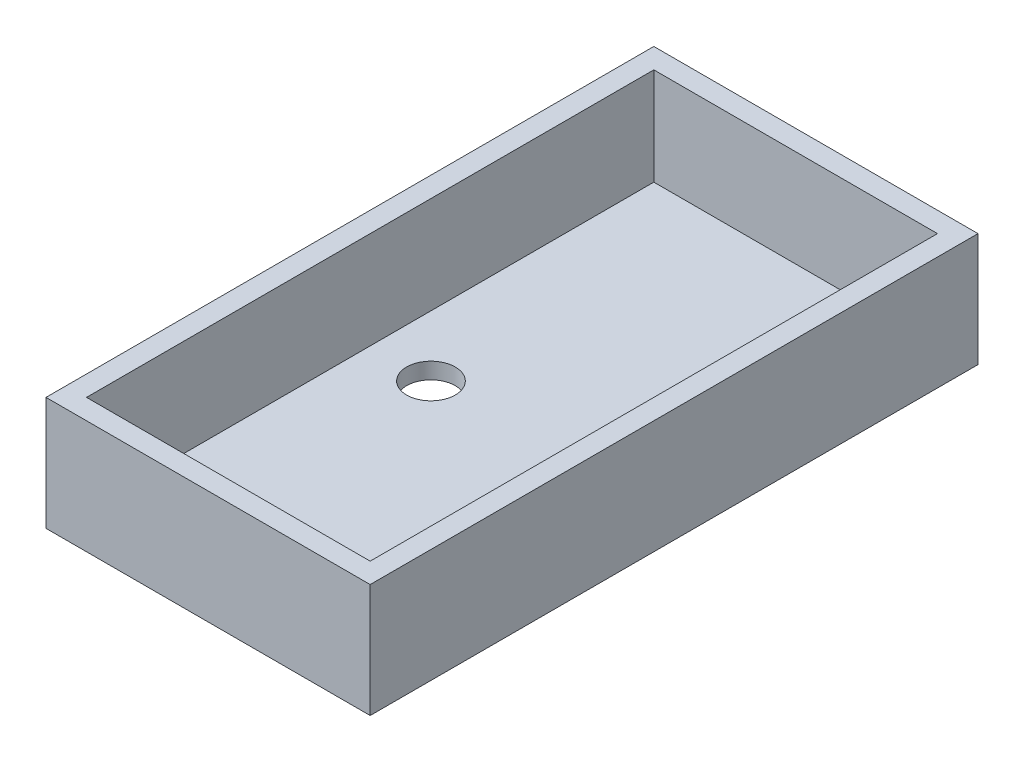
ISO-10303-21;
HEADER;
FILE_DESCRIPTION(('STEP AP214'),'2;1');
FILE_NAME('part.step','',(''),(''),'','','');
FILE_SCHEMA(('AUTOMOTIVE_DESIGN { 1 0 10303 214 1 1 1 1 }'));
ENDSEC;
DATA;
#1=APPLICATION_CONTEXT('core data for automotive mechanical design processes');
#2=APPLICATION_PROTOCOL_DEFINITION('international standard','automotive_design',2000,#1);
#3=PRODUCT_CONTEXT('',#1,'mechanical');
#4=PRODUCT('Part','Part','',(#3));
#5=PRODUCT_RELATED_PRODUCT_CATEGORY('part','',(#4));
#6=PRODUCT_DEFINITION_FORMATION('','',#4);
#7=PRODUCT_DEFINITION_CONTEXT('part definition',#1,'design');
#8=PRODUCT_DEFINITION('design','',#6,#7);
#9=PRODUCT_DEFINITION_SHAPE('','',#8);
#10=(LENGTH_UNIT() NAMED_UNIT(*) SI_UNIT(.MILLI.,.METRE.));
#11=(NAMED_UNIT(*) PLANE_ANGLE_UNIT() SI_UNIT($,.RADIAN.));
#12=(NAMED_UNIT(*) SI_UNIT($,.STERADIAN.) SOLID_ANGLE_UNIT());
#13=UNCERTAINTY_MEASURE_WITH_UNIT(LENGTH_MEASURE(1.E-05),#10,'distance_accuracy_value','');
#14=(GEOMETRIC_REPRESENTATION_CONTEXT(3) GLOBAL_UNCERTAINTY_ASSIGNED_CONTEXT((#13)) GLOBAL_UNIT_ASSIGNED_CONTEXT((#10,
#11,#12)) REPRESENTATION_CONTEXT('',''));
#15=CARTESIAN_POINT('',(0.,0.,0.));
#16=DIRECTION('',(0.,0.,1.));
#17=DIRECTION('',(1.,0.,0.));
#18=AXIS2_PLACEMENT_3D('',#15,#16,#17);
#19=CARTESIAN_POINT('',(0.,14.,0.));
#20=DIRECTION('',(0.,1.,0.));
#21=DIRECTION('',(0.,0.,-1.));
#22=AXIS2_PLACEMENT_3D('',#19,#20,#21);
#23=PLANE('',#22);
#24=DIRECTION('',(0.,0.,1.));
#25=VECTOR('',#24,1.);
#26=CARTESIAN_POINT('',(17.5,14.,35.));
#27=LINE('',#26,#25);
#28=CARTESIAN_POINT('',(17.5,14.,-35.));
#29=VERTEX_POINT('',#28);
#30=CARTESIAN_POINT('',(17.5,14.,35.));
#31=VERTEX_POINT('',#30);
#32=EDGE_CURVE('E143',#29,#31,#27,.T.);
#33=ORIENTED_EDGE('',*,*,#32,.T.);
#34=DIRECTION('',(-1.,0.,0.));
#35=VECTOR('',#34,1.);
#36=CARTESIAN_POINT('',(-17.5,14.,35.));
#37=LINE('',#36,#35);
#38=CARTESIAN_POINT('',(-17.5,14.,35.));
#39=VERTEX_POINT('',#38);
#40=EDGE_CURVE('E125',#31,#39,#37,.T.);
#41=ORIENTED_EDGE('',*,*,#40,.T.);
#42=DIRECTION('',(0.,0.,-1.));
#43=VECTOR('',#42,1.);
#44=CARTESIAN_POINT('',(-17.5,14.,35.));
#45=LINE('',#44,#43);
#46=CARTESIAN_POINT('',(-17.5,14.,-35.));
#47=VERTEX_POINT('',#46);
#48=EDGE_CURVE('E135',#39,#47,#45,.T.);
#49=ORIENTED_EDGE('',*,*,#48,.T.);
#50=DIRECTION('',(1.,0.,0.));
#51=VECTOR('',#50,1.);
#52=CARTESIAN_POINT('',(-17.5,14.,-35.));
#53=LINE('',#52,#51);
#54=EDGE_CURVE('E132',#47,#29,#53,.T.);
#55=ORIENTED_EDGE('',*,*,#54,.T.);
#56=EDGE_LOOP('',(#33,#41,#49,#55));
#57=FACE_BOUND('',#56,.T.);
#58=DIRECTION('',(0.,0.,1.));
#59=VECTOR('',#58,1.);
#60=CARTESIAN_POINT('',(20.,14.,37.5));
#61=LINE('',#60,#59);
#62=CARTESIAN_POINT('',(20.,14.,-37.5));
#63=VERTEX_POINT('',#62);
#64=CARTESIAN_POINT('',(20.,14.,37.5));
#65=VERTEX_POINT('',#64);
#66=EDGE_CURVE('E154',#63,#65,#61,.T.);
#67=ORIENTED_EDGE('',*,*,#66,.F.);
#68=DIRECTION('',(1.,0.,0.));
#69=VECTOR('',#68,1.);
#70=CARTESIAN_POINT('',(-20.,14.,-37.5));
#71=LINE('',#70,#69);
#72=CARTESIAN_POINT('',(-20.,14.,-37.5));
#73=VERTEX_POINT('',#72);
#74=EDGE_CURVE('E163',#73,#63,#71,.T.);
#75=ORIENTED_EDGE('',*,*,#74,.F.);
#76=DIRECTION('',(0.,0.,-1.));
#77=VECTOR('',#76,1.);
#78=CARTESIAN_POINT('',(-20.,14.,37.5));
#79=LINE('',#78,#77);
#80=CARTESIAN_POINT('',(-20.,14.,37.5));
#81=VERTEX_POINT('',#80);
#82=EDGE_CURVE('E159',#81,#73,#79,.T.);
#83=ORIENTED_EDGE('',*,*,#82,.F.);
#84=DIRECTION('',(-1.,0.,0.));
#85=VECTOR('',#84,1.);
#86=CARTESIAN_POINT('',(-20.,14.,37.5));
#87=LINE('',#86,#85);
#88=EDGE_CURVE('E156',#65,#81,#87,.T.);
#89=ORIENTED_EDGE('',*,*,#88,.F.);
#90=EDGE_LOOP('',(#67,#75,#83,#89));
#91=FACE_BOUND('',#90,.T.);
#92=ADVANCED_FACE('F40',(#57,#91),#23,.T.);
#93=CARTESIAN_POINT('',(0.,0.,0.));
#94=DIRECTION('',(0.,1.,0.));
#95=DIRECTION('',(0.,0.,-1.));
#96=AXIS2_PLACEMENT_3D('',#93,#94,#95);
#97=PLANE('',#96);
#98=CARTESIAN_POINT('',(-9.99999999999999,0.,0.));
#99=DIRECTION('',(0.,-1.,0.));
#100=DIRECTION('',(0.,0.,-1.));
#101=AXIS2_PLACEMENT_3D('',#98,#99,#100);
#102=CIRCLE('',#101,3.);
#103=CARTESIAN_POINT('',(-9.99999999999999,0.,-3.));
#104=VERTEX_POINT('',#103);
#105=EDGE_CURVE('E145',#104,#104,#102,.T.);
#106=ORIENTED_EDGE('',*,*,#105,.F.);
#107=EDGE_LOOP('',(#106));
#108=FACE_BOUND('',#107,.T.);
#109=CARTESIAN_POINT('',(10.,0.,0.));
#110=DIRECTION('',(0.,-1.,0.));
#111=DIRECTION('',(0.,0.,-1.));
#112=AXIS2_PLACEMENT_3D('',#109,#110,#111);
#113=CIRCLE('',#112,3.);
#114=CARTESIAN_POINT('',(10.,0.,-3.));
#115=VERTEX_POINT('',#114);
#116=EDGE_CURVE('E234',#115,#115,#113,.T.);
#117=ORIENTED_EDGE('',*,*,#116,.F.);
#118=EDGE_LOOP('',(#117));
#119=FACE_BOUND('',#118,.T.);
#120=DIRECTION('',(0.,0.,1.));
#121=VECTOR('',#120,1.);
#122=CARTESIAN_POINT('',(20.,0.,37.5));
#123=LINE('',#122,#121);
#124=CARTESIAN_POINT('',(20.,0.,-37.5));
#125=VERTEX_POINT('',#124);
#126=CARTESIAN_POINT('',(20.,0.,37.5));
#127=VERTEX_POINT('',#126);
#128=EDGE_CURVE('E150',#125,#127,#123,.T.);
#129=ORIENTED_EDGE('',*,*,#128,.T.);
#130=DIRECTION('',(-1.,0.,0.));
#131=VECTOR('',#130,1.);
#132=CARTESIAN_POINT('',(-20.,0.,37.5));
#133=LINE('',#132,#131);
#134=CARTESIAN_POINT('',(-20.,0.,37.5));
#135=VERTEX_POINT('',#134);
#136=EDGE_CURVE('E167',#127,#135,#133,.T.);
#137=ORIENTED_EDGE('',*,*,#136,.T.);
#138=DIRECTION('',(0.,0.,-1.));
#139=VECTOR('',#138,1.);
#140=CARTESIAN_POINT('',(-20.,0.,37.5));
#141=LINE('',#140,#139);
#142=CARTESIAN_POINT('',(-20.,0.,-37.5));
#143=VERTEX_POINT('',#142);
#144=EDGE_CURVE('E170',#135,#143,#141,.T.);
#145=ORIENTED_EDGE('',*,*,#144,.T.);
#146=DIRECTION('',(1.,0.,0.));
#147=VECTOR('',#146,1.);
#148=CARTESIAN_POINT('',(-20.,0.,-37.5));
#149=LINE('',#148,#147);
#150=EDGE_CURVE('E157',#143,#125,#149,.T.);
#151=ORIENTED_EDGE('',*,*,#150,.T.);
#152=EDGE_LOOP('',(#129,#137,#145,#151));
#153=FACE_BOUND('',#152,.T.);
#154=ADVANCED_FACE('F184',(#108,#119,#153),#97,.F.);
#155=CARTESIAN_POINT('',(20.,14.,37.5));
#156=DIRECTION('',(-1.,0.,0.));
#157=DIRECTION('',(0.,0.,-1.));
#158=AXIS2_PLACEMENT_3D('',#155,#156,#157);
#159=PLANE('',#158);
#160=ORIENTED_EDGE('',*,*,#128,.F.);
#161=DIRECTION('',(0.,-1.,0.));
#162=VECTOR('',#161,1.);
#163=CARTESIAN_POINT('',(20.,14.,-37.5));
#164=LINE('',#163,#162);
#165=EDGE_CURVE('E64',#63,#125,#164,.T.);
#166=ORIENTED_EDGE('',*,*,#165,.F.);
#167=ORIENTED_EDGE('',*,*,#66,.T.);
#168=DIRECTION('',(0.,-1.,0.));
#169=VECTOR('',#168,1.);
#170=CARTESIAN_POINT('',(20.,14.,37.5));
#171=LINE('',#170,#169);
#172=EDGE_CURVE('E11',#65,#127,#171,.T.);
#173=ORIENTED_EDGE('',*,*,#172,.T.);
#174=EDGE_LOOP('',(#160,#166,#167,#173));
#175=FACE_BOUND('',#174,.T.);
#176=ADVANCED_FACE('F42',(#175),#159,.F.);
#177=CARTESIAN_POINT('',(-20.,14.,37.5));
#178=DIRECTION('',(0.,0.,-1.));
#179=DIRECTION('',(1.,0.,0.));
#180=AXIS2_PLACEMENT_3D('',#177,#178,#179);
#181=PLANE('',#180);
#182=ORIENTED_EDGE('',*,*,#136,.F.);
#183=ORIENTED_EDGE('',*,*,#172,.F.);
#184=ORIENTED_EDGE('',*,*,#88,.T.);
#185=DIRECTION('',(0.,-1.,0.));
#186=VECTOR('',#185,1.);
#187=CARTESIAN_POINT('',(-20.,14.,37.5));
#188=LINE('',#187,#186);
#189=EDGE_CURVE('E48',#81,#135,#188,.T.);
#190=ORIENTED_EDGE('',*,*,#189,.T.);
#191=EDGE_LOOP('',(#182,#183,#184,#190));
#192=FACE_BOUND('',#191,.T.);
#193=ADVANCED_FACE('F179',(#192),#181,.F.);
#194=CARTESIAN_POINT('',(-20.,14.,37.5));
#195=DIRECTION('',(1.,0.,0.));
#196=DIRECTION('',(0.,0.,1.));
#197=AXIS2_PLACEMENT_3D('',#194,#195,#196);
#198=PLANE('',#197);
#199=ORIENTED_EDGE('',*,*,#144,.F.);
#200=ORIENTED_EDGE('',*,*,#189,.F.);
#201=ORIENTED_EDGE('',*,*,#82,.T.);
#202=DIRECTION('',(0.,-1.,0.));
#203=VECTOR('',#202,1.);
#204=CARTESIAN_POINT('',(-20.,14.,-37.5));
#205=LINE('',#204,#203);
#206=EDGE_CURVE('E177',#73,#143,#205,.T.);
#207=ORIENTED_EDGE('',*,*,#206,.T.);
#208=EDGE_LOOP('',(#199,#200,#201,#207));
#209=FACE_BOUND('',#208,.T.);
#210=ADVANCED_FACE('F182',(#209),#198,.F.);
#211=CARTESIAN_POINT('',(-20.,14.,-37.5));
#212=DIRECTION('',(0.,0.,1.));
#213=DIRECTION('',(-1.,0.,0.));
#214=AXIS2_PLACEMENT_3D('',#211,#212,#213);
#215=PLANE('',#214);
#216=ORIENTED_EDGE('',*,*,#150,.F.);
#217=ORIENTED_EDGE('',*,*,#206,.F.);
#218=ORIENTED_EDGE('',*,*,#74,.T.);
#219=ORIENTED_EDGE('',*,*,#165,.T.);
#220=EDGE_LOOP('',(#216,#217,#218,#219));
#221=FACE_BOUND('',#220,.T.);
#222=ADVANCED_FACE('F188',(#221),#215,.F.);
#223=CARTESIAN_POINT('',(17.5,2.,35.));
#224=DIRECTION('',(1.,0.,0.));
#225=DIRECTION('',(0.,0.,1.));
#226=AXIS2_PLACEMENT_3D('',#223,#224,#225);
#227=PLANE('',#226);
#228=ORIENTED_EDGE('',*,*,#32,.F.);
#229=DIRECTION('',(0.,1.,0.));
#230=VECTOR('',#229,1.);
#231=CARTESIAN_POINT('',(17.5,2.,-35.));
#232=LINE('',#231,#230);
#233=CARTESIAN_POINT('',(17.5,2.,-35.));
#234=VERTEX_POINT('',#233);
#235=EDGE_CURVE('E131',#234,#29,#232,.T.);
#236=ORIENTED_EDGE('',*,*,#235,.F.);
#237=DIRECTION('',(0.,0.,1.));
#238=VECTOR('',#237,1.);
#239=CARTESIAN_POINT('',(17.5,2.,35.));
#240=LINE('',#239,#238);
#241=CARTESIAN_POINT('',(17.5,2.,35.));
#242=VERTEX_POINT('',#241);
#243=EDGE_CURVE('E117',#234,#242,#240,.T.);
#244=ORIENTED_EDGE('',*,*,#243,.T.);
#245=DIRECTION('',(0.,1.,0.));
#246=VECTOR('',#245,1.);
#247=CARTESIAN_POINT('',(17.5,2.,35.));
#248=LINE('',#247,#246);
#249=EDGE_CURVE('E55',#242,#31,#248,.T.);
#250=ORIENTED_EDGE('',*,*,#249,.T.);
#251=EDGE_LOOP('',(#228,#236,#244,#250));
#252=FACE_BOUND('',#251,.T.);
#253=ADVANCED_FACE('F130',(#252),#227,.F.);
#254=CARTESIAN_POINT('',(-17.5,2.,-35.));
#255=DIRECTION('',(0.,0.,-1.));
#256=DIRECTION('',(1.,0.,0.));
#257=AXIS2_PLACEMENT_3D('',#254,#255,#256);
#258=PLANE('',#257);
#259=ORIENTED_EDGE('',*,*,#54,.F.);
#260=DIRECTION('',(0.,1.,0.));
#261=VECTOR('',#260,1.);
#262=CARTESIAN_POINT('',(-17.5,2.,-35.));
#263=LINE('',#262,#261);
#264=CARTESIAN_POINT('',(-17.5,2.,-35.));
#265=VERTEX_POINT('',#264);
#266=EDGE_CURVE('E151',#265,#47,#263,.T.);
#267=ORIENTED_EDGE('',*,*,#266,.F.);
#268=DIRECTION('',(1.,0.,0.));
#269=VECTOR('',#268,1.);
#270=CARTESIAN_POINT('',(-17.5,2.,-35.));
#271=LINE('',#270,#269);
#272=EDGE_CURVE('E128',#265,#234,#271,.T.);
#273=ORIENTED_EDGE('',*,*,#272,.T.);
#274=ORIENTED_EDGE('',*,*,#235,.T.);
#275=EDGE_LOOP('',(#259,#267,#273,#274));
#276=FACE_BOUND('',#275,.T.);
#277=ADVANCED_FACE('F195',(#276),#258,.F.);
#278=CARTESIAN_POINT('',(-17.5,2.,35.));
#279=DIRECTION('',(-1.,0.,0.));
#280=DIRECTION('',(0.,0.,-1.));
#281=AXIS2_PLACEMENT_3D('',#278,#279,#280);
#282=PLANE('',#281);
#283=ORIENTED_EDGE('',*,*,#48,.F.);
#284=DIRECTION('',(0.,1.,0.));
#285=VECTOR('',#284,1.);
#286=CARTESIAN_POINT('',(-17.5,2.,35.));
#287=LINE('',#286,#285);
#288=CARTESIAN_POINT('',(-17.5,2.,35.));
#289=VERTEX_POINT('',#288);
#290=EDGE_CURVE('E127',#289,#39,#287,.T.);
#291=ORIENTED_EDGE('',*,*,#290,.F.);
#292=DIRECTION('',(0.,0.,-1.));
#293=VECTOR('',#292,1.);
#294=CARTESIAN_POINT('',(-17.5,2.,35.));
#295=LINE('',#294,#293);
#296=EDGE_CURVE('E119',#289,#265,#295,.T.);
#297=ORIENTED_EDGE('',*,*,#296,.T.);
#298=ORIENTED_EDGE('',*,*,#266,.T.);
#299=EDGE_LOOP('',(#283,#291,#297,#298));
#300=FACE_BOUND('',#299,.T.);
#301=ADVANCED_FACE('F209',(#300),#282,.F.);
#302=CARTESIAN_POINT('',(-17.5,2.,35.));
#303=DIRECTION('',(0.,0.,1.));
#304=DIRECTION('',(-1.,0.,0.));
#305=AXIS2_PLACEMENT_3D('',#302,#303,#304);
#306=PLANE('',#305);
#307=ORIENTED_EDGE('',*,*,#40,.F.);
#308=ORIENTED_EDGE('',*,*,#249,.F.);
#309=DIRECTION('',(-1.,0.,0.));
#310=VECTOR('',#309,1.);
#311=CARTESIAN_POINT('',(-17.5,2.,35.));
#312=LINE('',#311,#310);
#313=EDGE_CURVE('E114',#242,#289,#312,.T.);
#314=ORIENTED_EDGE('',*,*,#313,.T.);
#315=ORIENTED_EDGE('',*,*,#290,.T.);
#316=EDGE_LOOP('',(#307,#308,#314,#315));
#317=FACE_BOUND('',#316,.T.);
#318=ADVANCED_FACE('F123',(#317),#306,.F.);
#319=CARTESIAN_POINT('',(0.,2.,0.));
#320=DIRECTION('',(0.,1.,0.));
#321=DIRECTION('',(0.,0.,-1.));
#322=AXIS2_PLACEMENT_3D('',#319,#320,#321);
#323=PLANE('',#322);
#324=CARTESIAN_POINT('',(-9.99999999999999,2.,0.));
#325=DIRECTION('',(0.,-1.,0.));
#326=DIRECTION('',(0.,0.,-1.));
#327=AXIS2_PLACEMENT_3D('',#324,#325,#326);
#328=CIRCLE('',#327,3.);
#329=CARTESIAN_POINT('',(-9.99999999999999,2.,-3.));
#330=VERTEX_POINT('',#329);
#331=EDGE_CURVE('E233',#330,#330,#328,.T.);
#332=ORIENTED_EDGE('',*,*,#331,.T.);
#333=EDGE_LOOP('',(#332));
#334=FACE_BOUND('',#333,.T.);
#335=CARTESIAN_POINT('',(10.,2.,0.));
#336=DIRECTION('',(0.,-1.,0.));
#337=DIRECTION('',(0.,0.,-1.));
#338=AXIS2_PLACEMENT_3D('',#335,#336,#337);
#339=CIRCLE('',#338,3.);
#340=CARTESIAN_POINT('',(10.,2.,-3.));
#341=VERTEX_POINT('',#340);
#342=EDGE_CURVE('E138',#341,#341,#339,.T.);
#343=ORIENTED_EDGE('',*,*,#342,.T.);
#344=EDGE_LOOP('',(#343));
#345=FACE_BOUND('',#344,.T.);
#346=ORIENTED_EDGE('',*,*,#243,.F.);
#347=ORIENTED_EDGE('',*,*,#272,.F.);
#348=ORIENTED_EDGE('',*,*,#296,.F.);
#349=ORIENTED_EDGE('',*,*,#313,.F.);
#350=EDGE_LOOP('',(#346,#347,#348,#349));
#351=FACE_BOUND('',#350,.T.);
#352=ADVANCED_FACE('F115',(#334,#345,#351),#323,.T.);
#353=CARTESIAN_POINT('',(10.,0.,0.));
#354=DIRECTION('',(0.,1.,0.));
#355=DIRECTION('',(0.,0.,-1.));
#356=AXIS2_PLACEMENT_3D('',#353,#354,#355);
#357=CYLINDRICAL_SURFACE('',#356,3.);
#358=ORIENTED_EDGE('',*,*,#116,.T.);
#359=EDGE_LOOP('',(#358));
#360=FACE_BOUND('',#359,.T.);
#361=ORIENTED_EDGE('',*,*,#342,.F.);
#362=EDGE_LOOP('',(#361));
#363=FACE_BOUND('',#362,.T.);
#364=ADVANCED_FACE('F218',(#360,#363),#357,.F.);
#365=CARTESIAN_POINT('',(-9.99999999999999,0.,0.));
#366=DIRECTION('',(0.,1.,0.));
#367=DIRECTION('',(0.,0.,-1.));
#368=AXIS2_PLACEMENT_3D('',#365,#366,#367);
#369=CYLINDRICAL_SURFACE('',#368,3.);
#370=ORIENTED_EDGE('',*,*,#105,.T.);
#371=EDGE_LOOP('',(#370));
#372=FACE_BOUND('',#371,.T.);
#373=ORIENTED_EDGE('',*,*,#331,.F.);
#374=EDGE_LOOP('',(#373));
#375=FACE_BOUND('',#374,.T.);
#376=ADVANCED_FACE('F222',(#372,#375),#369,.F.);
#377=CLOSED_SHELL('',(#92,#154,#176,#193,#210,#222,#253,#277,#301,#318,#352,#364,#376));
#378=MANIFOLD_SOLID_BREP('B2',#377);
#379=ADVANCED_BREP_SHAPE_REPRESENTATION('',(#18,#378),#14);
#380=SHAPE_DEFINITION_REPRESENTATION(#9,#379);
ENDSEC;
END-ISO-10303-21;
